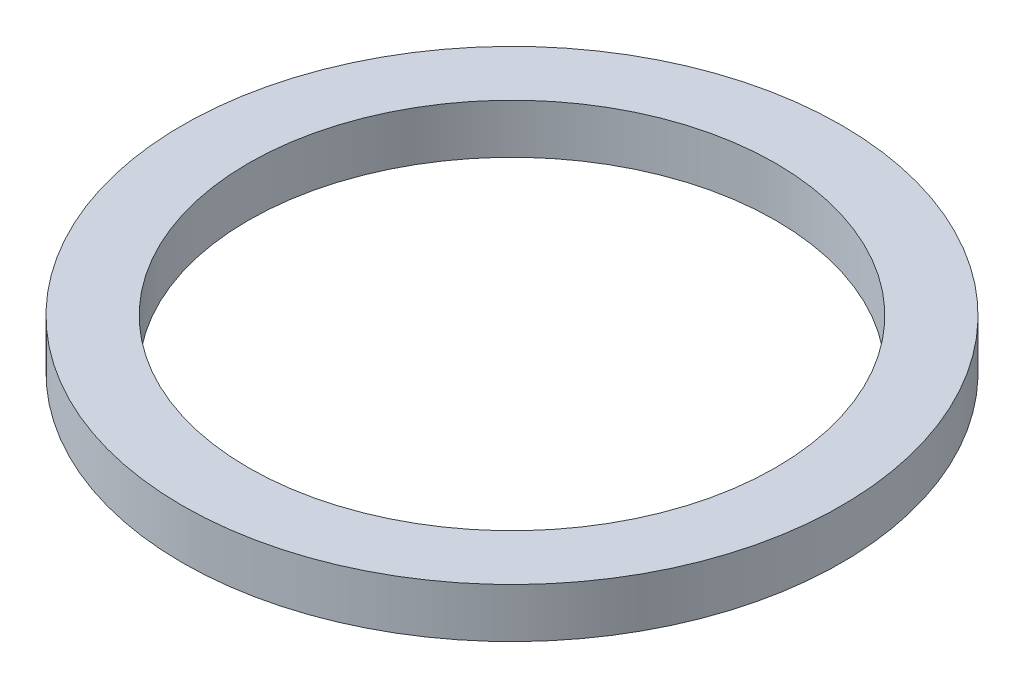
ISO-10303-21;
HEADER;
FILE_DESCRIPTION(('STEP AP214'),'2;1');
FILE_NAME('part.step','',(''),(''),'','','');
FILE_SCHEMA(('AUTOMOTIVE_DESIGN { 1 0 10303 214 1 1 1 1 }'));
ENDSEC;
DATA;
#1=APPLICATION_CONTEXT('core data for automotive mechanical design processes');
#2=APPLICATION_PROTOCOL_DEFINITION('international standard','automotive_design',2000,#1);
#3=PRODUCT_CONTEXT('',#1,'mechanical');
#4=PRODUCT('Part','Part','',(#3));
#5=PRODUCT_RELATED_PRODUCT_CATEGORY('part','',(#4));
#6=PRODUCT_DEFINITION_FORMATION('','',#4);
#7=PRODUCT_DEFINITION_CONTEXT('part definition',#1,'design');
#8=PRODUCT_DEFINITION('design','',#6,#7);
#9=PRODUCT_DEFINITION_SHAPE('','',#8);
#10=(LENGTH_UNIT() NAMED_UNIT(*) SI_UNIT(.MILLI.,.METRE.));
#11=(NAMED_UNIT(*) PLANE_ANGLE_UNIT() SI_UNIT($,.RADIAN.));
#12=(NAMED_UNIT(*) SI_UNIT($,.STERADIAN.) SOLID_ANGLE_UNIT());
#13=UNCERTAINTY_MEASURE_WITH_UNIT(LENGTH_MEASURE(1.E-05),#10,'distance_accuracy_value','');
#14=(GEOMETRIC_REPRESENTATION_CONTEXT(3) GLOBAL_UNCERTAINTY_ASSIGNED_CONTEXT((#13)) GLOBAL_UNIT_ASSIGNED_CONTEXT((#10,
#11,#12)) REPRESENTATION_CONTEXT('',''));
#15=CARTESIAN_POINT('',(0.,0.,0.));
#16=DIRECTION('',(0.,0.,1.));
#17=DIRECTION('',(1.,0.,0.));
#18=AXIS2_PLACEMENT_3D('',#15,#16,#17);
#19=CARTESIAN_POINT('',(0.,0.75,0.));
#20=DIRECTION('',(0.,1.,0.));
#21=DIRECTION('',(0.,0.,1.));
#22=AXIS2_PLACEMENT_3D('',#19,#20,#21);
#23=PLANE('',#22);
#24=CARTESIAN_POINT('',(0.,0.75,0.));
#25=DIRECTION('',(0.,1.,0.));
#26=DIRECTION('',(0.,0.,1.));
#27=AXIS2_PLACEMENT_3D('',#24,#25,#26);
#28=CIRCLE('',#27,5.);
#29=CARTESIAN_POINT('',(0.,0.75,5.));
#30=VERTEX_POINT('',#29);
#31=EDGE_CURVE('E10',#30,#30,#28,.T.);
#32=ORIENTED_EDGE('',*,*,#31,.T.);
#33=EDGE_LOOP('',(#32));
#34=FACE_BOUND('',#33,.T.);
#35=CARTESIAN_POINT('',(0.,0.75,0.));
#36=DIRECTION('',(0.,1.,0.));
#37=DIRECTION('',(0.,0.,1.));
#38=AXIS2_PLACEMENT_3D('',#35,#36,#37);
#39=CIRCLE('',#38,4.);
#40=CARTESIAN_POINT('',(0.,0.75,4.));
#41=VERTEX_POINT('',#40);
#42=EDGE_CURVE('E56',#41,#41,#39,.T.);
#43=ORIENTED_EDGE('',*,*,#42,.F.);
#44=EDGE_LOOP('',(#43));
#45=FACE_BOUND('',#44,.T.);
#46=ADVANCED_FACE('F43',(#34,#45),#23,.T.);
#47=CARTESIAN_POINT('',(0.,0.,0.));
#48=DIRECTION('',(0.,1.,0.));
#49=DIRECTION('',(0.,0.,1.));
#50=AXIS2_PLACEMENT_3D('',#47,#48,#49);
#51=PLANE('',#50);
#52=CARTESIAN_POINT('',(0.,0.,0.));
#53=DIRECTION('',(0.,1.,0.));
#54=DIRECTION('',(0.,0.,1.));
#55=AXIS2_PLACEMENT_3D('',#52,#53,#54);
#56=CIRCLE('',#55,5.);
#57=CARTESIAN_POINT('',(0.,0.,5.));
#58=VERTEX_POINT('',#57);
#59=EDGE_CURVE('E47',#58,#58,#56,.T.);
#60=ORIENTED_EDGE('',*,*,#59,.F.);
#61=EDGE_LOOP('',(#60));
#62=FACE_BOUND('',#61,.T.);
#63=CARTESIAN_POINT('',(0.,0.,0.));
#64=DIRECTION('',(0.,1.,0.));
#65=DIRECTION('',(0.,0.,1.));
#66=AXIS2_PLACEMENT_3D('',#63,#64,#65);
#67=CIRCLE('',#66,4.);
#68=CARTESIAN_POINT('',(0.,0.,4.));
#69=VERTEX_POINT('',#68);
#70=EDGE_CURVE('E58',#69,#69,#67,.T.);
#71=ORIENTED_EDGE('',*,*,#70,.T.);
#72=EDGE_LOOP('',(#71));
#73=FACE_BOUND('',#72,.T.);
#74=ADVANCED_FACE('F70',(#62,#73),#51,.F.);
#75=CARTESIAN_POINT('',(0.,0.75,0.));
#76=DIRECTION('',(0.,-1.,0.));
#77=DIRECTION('',(0.,0.,-1.));
#78=AXIS2_PLACEMENT_3D('',#75,#76,#77);
#79=CYLINDRICAL_SURFACE('',#78,5.);
#80=ORIENTED_EDGE('',*,*,#31,.F.);
#81=EDGE_LOOP('',(#80));
#82=FACE_BOUND('',#81,.T.);
#83=ORIENTED_EDGE('',*,*,#59,.T.);
#84=EDGE_LOOP('',(#83));
#85=FACE_BOUND('',#84,.T.);
#86=ADVANCED_FACE('F45',(#82,#85),#79,.T.);
#87=CARTESIAN_POINT('',(0.,0.75,0.));
#88=DIRECTION('',(0.,-1.,0.));
#89=DIRECTION('',(0.,0.,-1.));
#90=AXIS2_PLACEMENT_3D('',#87,#88,#89);
#91=CYLINDRICAL_SURFACE('',#90,4.);
#92=ORIENTED_EDGE('',*,*,#42,.T.);
#93=EDGE_LOOP('',(#92));
#94=FACE_BOUND('',#93,.T.);
#95=ORIENTED_EDGE('',*,*,#70,.F.);
#96=EDGE_LOOP('',(#95));
#97=FACE_BOUND('',#96,.T.);
#98=ADVANCED_FACE('F66',(#94,#97),#91,.F.);
#99=CLOSED_SHELL('',(#46,#74,#86,#98));
#100=MANIFOLD_SOLID_BREP('B2',#99);
#101=ADVANCED_BREP_SHAPE_REPRESENTATION('',(#18,#100),#14);
#102=SHAPE_DEFINITION_REPRESENTATION(#9,#101);
ENDSEC;
END-ISO-10303-21;
